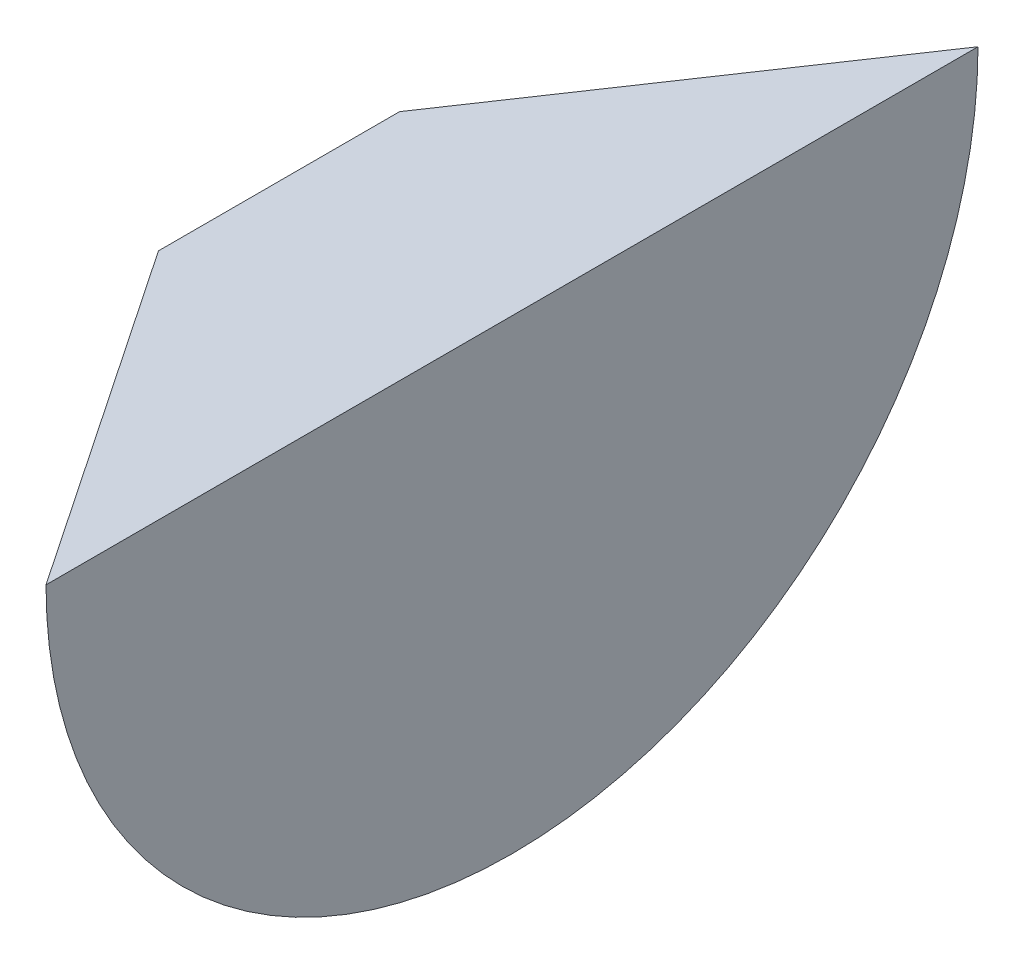
ISO-10303-21;
HEADER;
FILE_DESCRIPTION(('STEP AP214'),'2;1');
FILE_NAME('part.step','',(''),(''),'','','');
FILE_SCHEMA(('AUTOMOTIVE_DESIGN { 1 0 10303 214 1 1 1 1 }'));
ENDSEC;
DATA;
#1=APPLICATION_CONTEXT('core data for automotive mechanical design processes');
#2=APPLICATION_PROTOCOL_DEFINITION('international standard','automotive_design',2000,#1);
#3=PRODUCT_CONTEXT('',#1,'mechanical');
#4=PRODUCT('Part','Part','',(#3));
#5=PRODUCT_RELATED_PRODUCT_CATEGORY('part','',(#4));
#6=PRODUCT_DEFINITION_FORMATION('','',#4);
#7=PRODUCT_DEFINITION_CONTEXT('part definition',#1,'design');
#8=PRODUCT_DEFINITION('design','',#6,#7);
#9=PRODUCT_DEFINITION_SHAPE('','',#8);
#10=(LENGTH_UNIT() NAMED_UNIT(*) SI_UNIT(.MILLI.,.METRE.));
#11=(NAMED_UNIT(*) PLANE_ANGLE_UNIT() SI_UNIT($,.RADIAN.));
#12=(NAMED_UNIT(*) SI_UNIT($,.STERADIAN.) SOLID_ANGLE_UNIT());
#13=UNCERTAINTY_MEASURE_WITH_UNIT(LENGTH_MEASURE(1.E-05),#10,'distance_accuracy_value','');
#14=(GEOMETRIC_REPRESENTATION_CONTEXT(3) GLOBAL_UNCERTAINTY_ASSIGNED_CONTEXT((#13)) GLOBAL_UNIT_ASSIGNED_CONTEXT((#10,
#11,#12)) REPRESENTATION_CONTEXT('',''));
#15=CARTESIAN_POINT('',(0.,0.,0.));
#16=DIRECTION('',(0.,0.,1.));
#17=DIRECTION('',(1.,0.,0.));
#18=AXIS2_PLACEMENT_3D('',#15,#16,#17);
#19=CARTESIAN_POINT('',(20.25,12.25,-20.25));
#20=DIRECTION('',(-1.,0.,0.));
#21=DIRECTION('',(0.,0.,1.));
#22=AXIS2_PLACEMENT_3D('',#19,#20,#21);
#23=PLANE('',#22);
#24=CARTESIAN_POINT('',(20.25,22.05,0.));
#25=DIRECTION('',(1.,0.,0.));
#26=DIRECTION('',(0.,1.,0.));
#27=AXIS2_PLACEMENT_3D('',#24,#25,#26);
#28=CIRCLE('',#27,1.);
#29=CARTESIAN_POINT('',(20.25,22.05,1.));
#30=VERTEX_POINT('',#29);
#31=CARTESIAN_POINT('',(20.25,21.05,0.));
#32=VERTEX_POINT('',#31);
#33=EDGE_CURVE('E51',#30,#32,#28,.T.);
#34=ORIENTED_EDGE('',*,*,#33,.T.);
#35=CARTESIAN_POINT('',(20.25,22.05,0.));
#36=DIRECTION('',(1.,0.,0.));
#37=DIRECTION('',(0.,1.,0.));
#38=AXIS2_PLACEMENT_3D('',#35,#36,#37);
#39=CIRCLE('',#38,1.);
#40=CARTESIAN_POINT('',(20.25,22.05,-0.999999999999998));
#41=VERTEX_POINT('',#40);
#42=EDGE_CURVE('E91',#32,#41,#39,.T.);
#43=ORIENTED_EDGE('',*,*,#42,.T.);
#44=DIRECTION('',(0.,0.,-1.));
#45=VECTOR('',#44,1.);
#46=CARTESIAN_POINT('',(20.25,22.05,0.));
#47=LINE('',#46,#45);
#48=EDGE_CURVE('E98',#30,#41,#47,.T.);
#49=ORIENTED_EDGE('',*,*,#48,.F.);
#50=EDGE_LOOP('',(#34,#43,#49));
#51=FACE_BOUND('',#50,.T.);
#52=ADVANCED_FACE('F47',(#51),#23,.F.);
#53=CARTESIAN_POINT('',(19.75,22.05,0.));
#54=DIRECTION('',(1.,0.,0.));
#55=DIRECTION('',(0.,1.,0.));
#56=AXIS2_PLACEMENT_3D('',#53,#54,#55);
#57=PLANE('',#56);
#58=CARTESIAN_POINT('',(19.75,22.05,0.));
#59=DIRECTION('',(1.,0.,0.));
#60=DIRECTION('',(0.,1.,0.));
#61=AXIS2_PLACEMENT_3D('',#58,#59,#60);
#62=CIRCLE('',#61,0.258719515743628);
#63=CARTESIAN_POINT('',(19.75,21.7912804842564,0.));
#64=VERTEX_POINT('',#63);
#65=CARTESIAN_POINT('',(19.75,22.05,-0.258719515743628));
#66=VERTEX_POINT('',#65);
#67=EDGE_CURVE('E103',#64,#66,#62,.T.);
#68=ORIENTED_EDGE('',*,*,#67,.F.);
#69=CARTESIAN_POINT('',(19.75,22.05,0.));
#70=DIRECTION('',(1.,0.,0.));
#71=DIRECTION('',(0.,1.,0.));
#72=AXIS2_PLACEMENT_3D('',#69,#70,#71);
#73=CIRCLE('',#72,0.258719515743628);
#74=CARTESIAN_POINT('',(19.75,22.05,0.258719515743628));
#75=VERTEX_POINT('',#74);
#76=EDGE_CURVE('E11',#75,#64,#73,.T.);
#77=ORIENTED_EDGE('',*,*,#76,.F.);
#78=DIRECTION('',(0.,0.,1.));
#79=VECTOR('',#78,1.);
#80=CARTESIAN_POINT('',(19.75,22.05,0.));
#81=LINE('',#80,#79);
#82=EDGE_CURVE('E75',#66,#75,#81,.T.);
#83=ORIENTED_EDGE('',*,*,#82,.F.);
#84=EDGE_LOOP('',(#68,#77,#83));
#85=FACE_BOUND('',#84,.T.);
#86=ADVANCED_FACE('F121',(#85),#57,.F.);
#87=CARTESIAN_POINT('',(20.25,22.05,0.));
#88=DIRECTION('',(1.,0.,0.));
#89=DIRECTION('',(0.,1.,0.));
#90=AXIS2_PLACEMENT_3D('',#87,#88,#89);
#91=CONICAL_SURFACE('',#90,1.,0.977384381116825);
#92=DIRECTION('',(-0.559192903470746,0.,-0.829037572555042));
#93=VECTOR('',#92,1.);
#94=CARTESIAN_POINT('',(19.5754914831576,22.05,0.));
#95=LINE('',#94,#93);
#96=EDGE_CURVE('E112',#30,#75,#95,.T.);
#97=ORIENTED_EDGE('',*,*,#96,.T.);
#98=ORIENTED_EDGE('',*,*,#76,.T.);
#99=DIRECTION('',(0.559192903470746,-0.829037572555042,0.));
#100=VECTOR('',#99,1.);
#101=CARTESIAN_POINT('',(20.25,21.05,0.));
#102=LINE('',#101,#100);
#103=EDGE_CURVE('E57',#64,#32,#102,.T.);
#104=ORIENTED_EDGE('',*,*,#103,.T.);
#105=ORIENTED_EDGE('',*,*,#33,.F.);
#106=EDGE_LOOP('',(#97,#98,#104,#105));
#107=FACE_BOUND('',#106,.T.);
#108=ADVANCED_FACE('F101',(#107),#91,.T.);
#109=CARTESIAN_POINT('',(0.,22.05,0.));
#110=DIRECTION('',(0.,-1.,0.));
#111=DIRECTION('',(0.,0.,-1.));
#112=AXIS2_PLACEMENT_3D('',#109,#110,#111);
#113=PLANE('',#112);
#114=ORIENTED_EDGE('',*,*,#96,.F.);
#115=ORIENTED_EDGE('',*,*,#48,.T.);
#116=DIRECTION('',(0.559192903470746,0.,-0.829037572555042));
#117=VECTOR('',#116,1.);
#118=CARTESIAN_POINT('',(19.5754914831576,22.05,0.));
#119=LINE('',#118,#117);
#120=EDGE_CURVE('E95',#66,#41,#119,.T.);
#121=ORIENTED_EDGE('',*,*,#120,.F.);
#122=ORIENTED_EDGE('',*,*,#82,.T.);
#123=EDGE_LOOP('',(#114,#115,#121,#122));
#124=FACE_BOUND('',#123,.T.);
#125=ADVANCED_FACE('F49',(#124),#113,.F.);
#126=CARTESIAN_POINT('',(20.25,22.05,0.));
#127=DIRECTION('',(1.,0.,0.));
#128=DIRECTION('',(0.,1.,0.));
#129=AXIS2_PLACEMENT_3D('',#126,#127,#128);
#130=CONICAL_SURFACE('',#129,1.,0.977384381116825);
#131=ORIENTED_EDGE('',*,*,#120,.T.);
#132=ORIENTED_EDGE('',*,*,#42,.F.);
#133=ORIENTED_EDGE('',*,*,#103,.F.);
#134=ORIENTED_EDGE('',*,*,#67,.T.);
#135=EDGE_LOOP('',(#131,#132,#133,#134));
#136=FACE_BOUND('',#135,.T.);
#137=ADVANCED_FACE('F93',(#136),#130,.T.);
#138=CLOSED_SHELL('',(#52,#86,#108,#125,#137));
#139=MANIFOLD_SOLID_BREP('B2',#138);
#140=ADVANCED_BREP_SHAPE_REPRESENTATION('',(#18,#139),#14);
#141=SHAPE_DEFINITION_REPRESENTATION(#9,#140);
ENDSEC;
END-ISO-10303-21;
